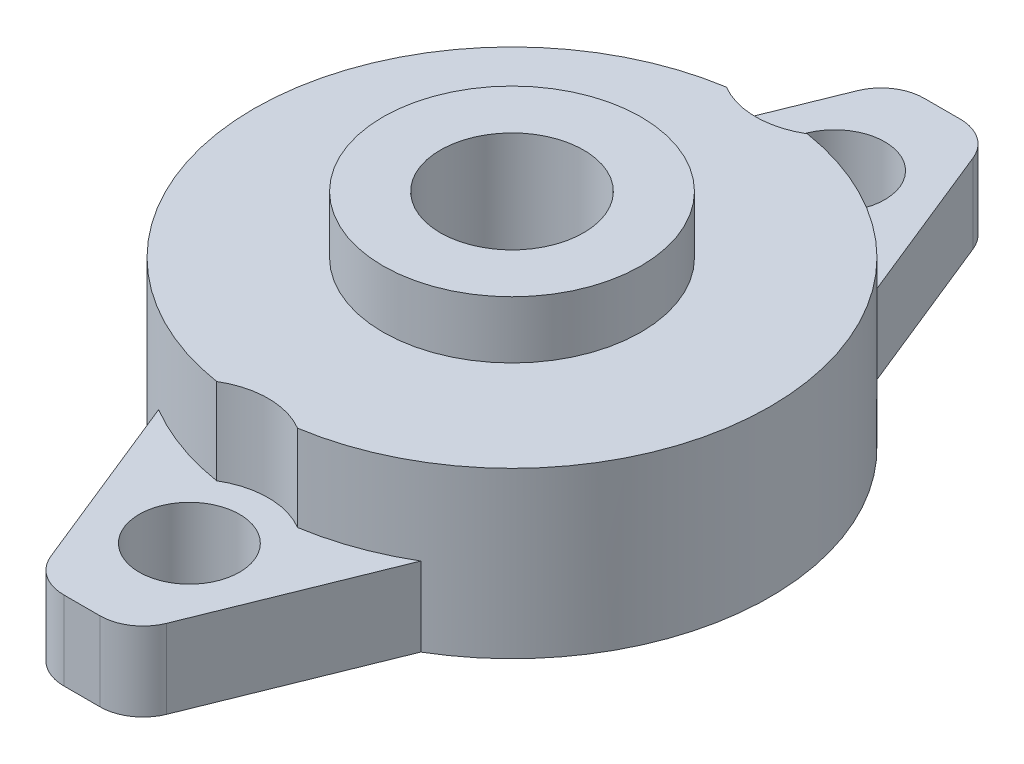
ISO-10303-21;
HEADER;
FILE_DESCRIPTION(('STEP AP214'),'2;1');
FILE_NAME('part.step','',(''),(''),'','','');
FILE_SCHEMA(('AUTOMOTIVE_DESIGN { 1 0 10303 214 1 1 1 1 }'));
ENDSEC;
DATA;
#1=APPLICATION_CONTEXT('core data for automotive mechanical design processes');
#2=APPLICATION_PROTOCOL_DEFINITION('international standard','automotive_design',2000,#1);
#3=PRODUCT_CONTEXT('',#1,'mechanical');
#4=PRODUCT('Part','Part','',(#3));
#5=PRODUCT_RELATED_PRODUCT_CATEGORY('part','',(#4));
#6=PRODUCT_DEFINITION_FORMATION('','',#4);
#7=PRODUCT_DEFINITION_CONTEXT('part definition',#1,'design');
#8=PRODUCT_DEFINITION('design','',#6,#7);
#9=PRODUCT_DEFINITION_SHAPE('','',#8);
#10=(LENGTH_UNIT() NAMED_UNIT(*) SI_UNIT(.MILLI.,.METRE.));
#11=(NAMED_UNIT(*) PLANE_ANGLE_UNIT() SI_UNIT($,.RADIAN.));
#12=(NAMED_UNIT(*) SI_UNIT($,.STERADIAN.) SOLID_ANGLE_UNIT());
#13=UNCERTAINTY_MEASURE_WITH_UNIT(LENGTH_MEASURE(1.E-05),#10,'distance_accuracy_value','');
#14=(GEOMETRIC_REPRESENTATION_CONTEXT(3) GLOBAL_UNCERTAINTY_ASSIGNED_CONTEXT((#13)) GLOBAL_UNIT_ASSIGNED_CONTEXT((#10,
#11,#12)) REPRESENTATION_CONTEXT('',''));
#15=CARTESIAN_POINT('',(0.,0.,0.));
#16=DIRECTION('',(0.,0.,1.));
#17=DIRECTION('',(1.,0.,0.));
#18=AXIS2_PLACEMENT_3D('',#15,#16,#17);
#19=CARTESIAN_POINT('',(0.,-4.5,0.));
#20=DIRECTION('',(0.,1.,0.));
#21=DIRECTION('',(0.,0.,1.));
#22=AXIS2_PLACEMENT_3D('',#19,#20,#21);
#23=CYLINDRICAL_SURFACE('',#22,5.);
#24=CARTESIAN_POINT('',(0.,15.5,0.));
#25=DIRECTION('',(0.,1.,0.));
#26=DIRECTION('',(0.,0.,1.));
#27=AXIS2_PLACEMENT_3D('',#24,#25,#26);
#28=CIRCLE('',#27,5.);
#29=CARTESIAN_POINT('',(0.,15.5,5.));
#30=VERTEX_POINT('',#29);
#31=EDGE_CURVE('E278',#30,#30,#28,.T.);
#32=ORIENTED_EDGE('',*,*,#31,.T.);
#33=EDGE_LOOP('',(#32));
#34=FACE_BOUND('',#33,.T.);
#35=CARTESIAN_POINT('',(0.,1.5,0.));
#36=DIRECTION('',(0.,-1.,0.));
#37=DIRECTION('',(0.,0.,-1.));
#38=AXIS2_PLACEMENT_3D('',#35,#36,#37);
#39=CIRCLE('',#38,5.);
#40=CARTESIAN_POINT('',(0.,1.5,-5.));
#41=VERTEX_POINT('',#40);
#42=EDGE_CURVE('E39',#41,#41,#39,.F.);
#43=ORIENTED_EDGE('',*,*,#42,.F.);
#44=EDGE_LOOP('',(#43));
#45=FACE_BOUND('',#44,.T.);
#46=ADVANCED_FACE('F35',(#34,#45),#23,.F.);
#47=CARTESIAN_POINT('',(0.,5.5,0.));
#48=DIRECTION('',(0.,1.,0.));
#49=DIRECTION('',(0.,0.,1.));
#50=AXIS2_PLACEMENT_3D('',#47,#48,#49);
#51=PLANE('',#50);
#52=CARTESIAN_POINT('',(0.,5.5,-22.5));
#53=DIRECTION('',(0.,1.,0.));
#54=DIRECTION('',(0.,0.,1.));
#55=AXIS2_PLACEMENT_3D('',#52,#53,#54);
#56=CIRCLE('',#55,3.5);
#57=CARTESIAN_POINT('',(0.,5.5,-19.));
#58=VERTEX_POINT('',#57);
#59=EDGE_CURVE('E185',#58,#58,#56,.T.);
#60=ORIENTED_EDGE('',*,*,#59,.F.);
#61=EDGE_LOOP('',(#60));
#62=FACE_BOUND('',#61,.T.);
#63=CARTESIAN_POINT('',(0.,5.5,0.));
#64=DIRECTION('',(0.,1.,0.));
#65=DIRECTION('',(0.,0.,1.));
#66=AXIS2_PLACEMENT_3D('',#63,#64,#65);
#67=CIRCLE('',#66,18.);
#68=CARTESIAN_POINT('',(-2.81968389787767,5.5,-17.7777777777778));
#69=VERTEX_POINT('',#68);
#70=CARTESIAN_POINT('',(-9.14202519140061,5.5,-15.5055917461991));
#71=VERTEX_POINT('',#70);
#72=EDGE_CURVE('E52',#69,#71,#67,.T.);
#73=ORIENTED_EDGE('',*,*,#72,.F.);
#74=CARTESIAN_POINT('',(0.,5.5,-22.5));
#75=DIRECTION('',(0.,-1.,0.));
#76=DIRECTION('',(0.,0.,1.));
#77=AXIS2_PLACEMENT_3D('',#74,#75,#76);
#78=CIRCLE('',#77,5.49999999999999);
#79=CARTESIAN_POINT('',(2.81968389787766,5.5,-17.7777777777778));
#80=VERTEX_POINT('',#79);
#81=EDGE_CURVE('E56',#80,#69,#78,.T.);
#82=ORIENTED_EDGE('',*,*,#81,.F.);
#83=CARTESIAN_POINT('',(0.,5.5,0.));
#84=DIRECTION('',(0.,1.,0.));
#85=DIRECTION('',(0.,0.,1.));
#86=AXIS2_PLACEMENT_3D('',#83,#84,#85);
#87=CIRCLE('',#86,18.);
#88=CARTESIAN_POINT('',(9.14202519140061,5.5,-15.5055917461991));
#89=VERTEX_POINT('',#88);
#90=EDGE_CURVE('E44',#89,#80,#87,.T.);
#91=ORIENTED_EDGE('',*,*,#90,.F.);
#92=DIRECTION('',(-0.374603074429063,0.,-0.927185276321995));
#93=VECTOR('',#92,1.);
#94=CARTESIAN_POINT('',(4.04399011530196,5.5,-28.1238092232872));
#95=LINE('',#94,#93);
#96=CARTESIAN_POINT('',(4.04399011530196,5.5,-28.1238092232872));
#97=VERTEX_POINT('',#96);
#98=EDGE_CURVE('E202',#89,#97,#95,.T.);
#99=ORIENTED_EDGE('',*,*,#98,.T.);
#100=CARTESIAN_POINT('',(1.26243428633598,5.5,-27.));
#101=DIRECTION('',(0.,1.,0.));
#102=DIRECTION('',(0.,0.,-1.));
#103=AXIS2_PLACEMENT_3D('',#100,#101,#102);
#104=CIRCLE('',#103,3.);
#105=CARTESIAN_POINT('',(1.26243428633598,5.5,-30.));
#106=VERTEX_POINT('',#105);
#107=EDGE_CURVE('E204',#97,#106,#104,.T.);
#108=ORIENTED_EDGE('',*,*,#107,.T.);
#109=DIRECTION('',(-1.,0.,0.));
#110=VECTOR('',#109,1.);
#111=CARTESIAN_POINT('',(-1.26243428633598,5.5,-30.));
#112=LINE('',#111,#110);
#113=CARTESIAN_POINT('',(-1.26243428633598,5.5,-30.));
#114=VERTEX_POINT('',#113);
#115=EDGE_CURVE('E206',#106,#114,#112,.T.);
#116=ORIENTED_EDGE('',*,*,#115,.T.);
#117=CARTESIAN_POINT('',(-1.26243428633598,5.5,-27.0000000000001));
#118=DIRECTION('',(0.,1.,0.));
#119=DIRECTION('',(0.,0.,-1.));
#120=AXIS2_PLACEMENT_3D('',#117,#118,#119);
#121=CIRCLE('',#120,2.99999999999993);
#122=CARTESIAN_POINT('',(-4.0439901153019,5.5,-28.1238092232872));
#123=VERTEX_POINT('',#122);
#124=EDGE_CURVE('E208',#114,#123,#121,.T.);
#125=ORIENTED_EDGE('',*,*,#124,.T.);
#126=DIRECTION('',(-0.374603074429066,0.,0.927185276321994));
#127=VECTOR('',#126,1.);
#128=CARTESIAN_POINT('',(-9.14202519140061,5.5,-15.5055917461991));
#129=LINE('',#128,#127);
#130=EDGE_CURVE('E210',#123,#71,#129,.T.);
#131=ORIENTED_EDGE('',*,*,#130,.T.);
#132=EDGE_LOOP('',(#73,#82,#91,#99,#108,#116,#125,#131));
#133=FACE_BOUND('',#132,.T.);
#134=ADVANCED_FACE('F317',(#62,#133),#51,.T.);
#135=CARTESIAN_POINT('',(0.,5.5,22.5));
#136=DIRECTION('',(0.,1.,0.));
#137=DIRECTION('',(0.,0.,1.));
#138=AXIS2_PLACEMENT_3D('',#135,#136,#137);
#139=CIRCLE('',#138,3.5);
#140=CARTESIAN_POINT('',(0.,5.5,26.));
#141=VERTEX_POINT('',#140);
#142=EDGE_CURVE('E176',#141,#141,#139,.T.);
#143=ORIENTED_EDGE('',*,*,#142,.F.);
#144=EDGE_LOOP('',(#143));
#145=FACE_BOUND('',#144,.T.);
#146=CARTESIAN_POINT('',(-9.14202519140061,5.5,15.5055917461991));
#147=VERTEX_POINT('',#146);
#148=CARTESIAN_POINT('',(-2.81968389787766,5.5,17.7777777777778));
#149=VERTEX_POINT('',#148);
#150=EDGE_CURVE('E172',#147,#149,#67,.T.);
#151=ORIENTED_EDGE('',*,*,#150,.F.);
#152=DIRECTION('',(0.374603074429063,0.,0.927185276321995));
#153=VECTOR('',#152,1.);
#154=CARTESIAN_POINT('',(-9.14202519140061,5.5,15.5055917461991));
#155=LINE('',#154,#153);
#156=CARTESIAN_POINT('',(-4.04399011530194,5.5,28.1238092232872));
#157=VERTEX_POINT('',#156);
#158=EDGE_CURVE('E191',#147,#157,#155,.T.);
#159=ORIENTED_EDGE('',*,*,#158,.T.);
#160=CARTESIAN_POINT('',(-1.26243428633598,5.5,27.0000000000001));
#161=DIRECTION('',(0.,1.,0.));
#162=DIRECTION('',(0.,0.,1.));
#163=AXIS2_PLACEMENT_3D('',#160,#161,#162);
#164=CIRCLE('',#163,2.99999999999995);
#165=CARTESIAN_POINT('',(-1.26243428633598,5.5,30.));
#166=VERTEX_POINT('',#165);
#167=EDGE_CURVE('E193',#157,#166,#164,.T.);
#168=ORIENTED_EDGE('',*,*,#167,.T.);
#169=DIRECTION('',(1.,0.,0.));
#170=VECTOR('',#169,1.);
#171=CARTESIAN_POINT('',(-1.26243428633598,5.5,30.));
#172=LINE('',#171,#170);
#173=CARTESIAN_POINT('',(1.26243428633598,5.5,30.));
#174=VERTEX_POINT('',#173);
#175=EDGE_CURVE('E196',#166,#174,#172,.T.);
#176=ORIENTED_EDGE('',*,*,#175,.T.);
#177=CARTESIAN_POINT('',(1.26243428633598,5.5,27.));
#178=DIRECTION('',(0.,1.,0.));
#179=DIRECTION('',(0.,0.,-1.));
#180=AXIS2_PLACEMENT_3D('',#177,#178,#179);
#181=CIRCLE('',#180,3.);
#182=CARTESIAN_POINT('',(4.04399011530196,5.5,28.1238092232872));
#183=VERTEX_POINT('',#182);
#184=EDGE_CURVE('E198',#174,#183,#181,.T.);
#185=ORIENTED_EDGE('',*,*,#184,.T.);
#186=DIRECTION('',(0.374603074429063,0.,-0.927185276321995));
#187=VECTOR('',#186,1.);
#188=CARTESIAN_POINT('',(4.04399011530196,5.5,28.1238092232872));
#189=LINE('',#188,#187);
#190=CARTESIAN_POINT('',(9.14202519140061,5.5,15.5055917461991));
#191=VERTEX_POINT('',#190);
#192=EDGE_CURVE('E200',#183,#191,#189,.T.);
#193=ORIENTED_EDGE('',*,*,#192,.T.);
#194=CARTESIAN_POINT('',(2.81968389787767,5.5,17.7777777777778));
#195=VERTEX_POINT('',#194);
#196=EDGE_CURVE('E272',#195,#191,#87,.T.);
#197=ORIENTED_EDGE('',*,*,#196,.F.);
#198=CARTESIAN_POINT('',(0.,5.5,22.5));
#199=DIRECTION('',(0.,-1.,0.));
#200=DIRECTION('',(0.,0.,1.));
#201=AXIS2_PLACEMENT_3D('',#198,#199,#200);
#202=CIRCLE('',#201,5.49999999999999);
#203=EDGE_CURVE('E275',#149,#195,#202,.T.);
#204=ORIENTED_EDGE('',*,*,#203,.F.);
#205=EDGE_LOOP('',(#151,#159,#168,#176,#185,#193,#197,#204));
#206=FACE_BOUND('',#205,.T.);
#207=ADVANCED_FACE('F296',(#145,#206),#51,.T.);
#208=CARTESIAN_POINT('',(0.,0.,0.));
#209=DIRECTION('',(0.,1.,0.));
#210=DIRECTION('',(0.,0.,1.));
#211=AXIS2_PLACEMENT_3D('',#208,#209,#210);
#212=PLANE('',#211);
#213=CARTESIAN_POINT('',(0.,0.,0.));
#214=DIRECTION('',(0.,-1.,0.));
#215=DIRECTION('',(0.,0.,-1.));
#216=AXIS2_PLACEMENT_3D('',#213,#214,#215);
#217=CIRCLE('',#216,14.);
#218=CARTESIAN_POINT('',(0.,0.,-14.));
#219=VERTEX_POINT('',#218);
#220=EDGE_CURVE('E552',#219,#219,#217,.T.);
#221=ORIENTED_EDGE('',*,*,#220,.F.);
#222=EDGE_LOOP('',(#221));
#223=FACE_BOUND('',#222,.T.);
#224=CARTESIAN_POINT('',(0.,0.,0.));
#225=DIRECTION('',(0.,1.,0.));
#226=DIRECTION('',(0.,0.,1.));
#227=AXIS2_PLACEMENT_3D('',#224,#225,#226);
#228=CIRCLE('',#227,18.);
#229=CARTESIAN_POINT('',(-9.14202519140061,0.,-15.5055917461991));
#230=VERTEX_POINT('',#229);
#231=CARTESIAN_POINT('',(-9.14202519140061,0.,15.5055917461991));
#232=VERTEX_POINT('',#231);
#233=EDGE_CURVE('E188',#230,#232,#228,.T.);
#234=ORIENTED_EDGE('',*,*,#233,.F.);
#235=DIRECTION('',(-0.374603074429066,0.,0.927185276321994));
#236=VECTOR('',#235,1.);
#237=CARTESIAN_POINT('',(-9.14202519140061,0.,-15.5055917461991));
#238=LINE('',#237,#236);
#239=CARTESIAN_POINT('',(-4.0439901153019,0.,-28.1238092232872));
#240=VERTEX_POINT('',#239);
#241=EDGE_CURVE('E194',#240,#230,#238,.T.);
#242=ORIENTED_EDGE('',*,*,#241,.F.);
#243=CARTESIAN_POINT('',(-1.26243428633598,0.,-27.0000000000001));
#244=DIRECTION('',(0.,1.,0.));
#245=DIRECTION('',(0.,0.,-1.));
#246=AXIS2_PLACEMENT_3D('',#243,#244,#245);
#247=CIRCLE('',#246,2.99999999999993);
#248=CARTESIAN_POINT('',(-1.26243428633598,0.,-30.));
#249=VERTEX_POINT('',#248);
#250=EDGE_CURVE('E232',#249,#240,#247,.T.);
#251=ORIENTED_EDGE('',*,*,#250,.F.);
#252=DIRECTION('',(-1.,0.,0.));
#253=VECTOR('',#252,1.);
#254=CARTESIAN_POINT('',(-1.26243428633598,0.,-30.));
#255=LINE('',#254,#253);
#256=CARTESIAN_POINT('',(1.26243428633598,0.,-30.));
#257=VERTEX_POINT('',#256);
#258=EDGE_CURVE('E230',#257,#249,#255,.T.);
#259=ORIENTED_EDGE('',*,*,#258,.F.);
#260=CARTESIAN_POINT('',(1.26243428633598,0.,-27.));
#261=DIRECTION('',(0.,1.,0.));
#262=DIRECTION('',(0.,0.,-1.));
#263=AXIS2_PLACEMENT_3D('',#260,#261,#262);
#264=CIRCLE('',#263,3.);
#265=CARTESIAN_POINT('',(4.04399011530196,0.,-28.1238092232872));
#266=VERTEX_POINT('',#265);
#267=EDGE_CURVE('E228',#266,#257,#264,.T.);
#268=ORIENTED_EDGE('',*,*,#267,.F.);
#269=DIRECTION('',(-0.374603074429063,0.,-0.927185276321995));
#270=VECTOR('',#269,1.);
#271=CARTESIAN_POINT('',(4.04399011530196,0.,-28.1238092232872));
#272=LINE('',#271,#270);
#273=CARTESIAN_POINT('',(9.14202519140061,0.,-15.5055917461991));
#274=VERTEX_POINT('',#273);
#275=EDGE_CURVE('E226',#274,#266,#272,.T.);
#276=ORIENTED_EDGE('',*,*,#275,.F.);
#277=CARTESIAN_POINT('',(0.,0.,0.));
#278=DIRECTION('',(0.,1.,0.));
#279=DIRECTION('',(0.,0.,1.));
#280=AXIS2_PLACEMENT_3D('',#277,#278,#279);
#281=CIRCLE('',#280,18.);
#282=CARTESIAN_POINT('',(9.14202519140061,0.,15.5055917461991));
#283=VERTEX_POINT('',#282);
#284=EDGE_CURVE('E224',#283,#274,#281,.T.);
#285=ORIENTED_EDGE('',*,*,#284,.F.);
#286=DIRECTION('',(0.374603074429063,0.,-0.927185276321995));
#287=VECTOR('',#286,1.);
#288=CARTESIAN_POINT('',(4.04399011530196,0.,28.1238092232872));
#289=LINE('',#288,#287);
#290=CARTESIAN_POINT('',(4.04399011530196,0.,28.1238092232872));
#291=VERTEX_POINT('',#290);
#292=EDGE_CURVE('E222',#291,#283,#289,.T.);
#293=ORIENTED_EDGE('',*,*,#292,.F.);
#294=CARTESIAN_POINT('',(1.26243428633598,0.,27.));
#295=DIRECTION('',(0.,1.,0.));
#296=DIRECTION('',(0.,0.,-1.));
#297=AXIS2_PLACEMENT_3D('',#294,#295,#296);
#298=CIRCLE('',#297,3.);
#299=CARTESIAN_POINT('',(1.26243428633598,0.,30.));
#300=VERTEX_POINT('',#299);
#301=EDGE_CURVE('E220',#300,#291,#298,.T.);
#302=ORIENTED_EDGE('',*,*,#301,.F.);
#303=DIRECTION('',(1.,0.,0.));
#304=VECTOR('',#303,1.);
#305=CARTESIAN_POINT('',(-1.26243428633598,0.,30.));
#306=LINE('',#305,#304);
#307=CARTESIAN_POINT('',(-1.26243428633598,0.,30.));
#308=VERTEX_POINT('',#307);
#309=EDGE_CURVE('E218',#308,#300,#306,.T.);
#310=ORIENTED_EDGE('',*,*,#309,.F.);
#311=CARTESIAN_POINT('',(-1.26243428633598,0.,27.0000000000001));
#312=DIRECTION('',(0.,1.,0.));
#313=DIRECTION('',(0.,0.,1.));
#314=AXIS2_PLACEMENT_3D('',#311,#312,#313);
#315=CIRCLE('',#314,2.99999999999995);
#316=CARTESIAN_POINT('',(-4.04399011530194,0.,28.1238092232872));
#317=VERTEX_POINT('',#316);
#318=EDGE_CURVE('E216',#317,#308,#315,.T.);
#319=ORIENTED_EDGE('',*,*,#318,.F.);
#320=DIRECTION('',(0.374603074429063,0.,0.927185276321995));
#321=VECTOR('',#320,1.);
#322=CARTESIAN_POINT('',(-9.14202519140061,0.,15.5055917461991));
#323=LINE('',#322,#321);
#324=EDGE_CURVE('E214',#232,#317,#323,.T.);
#325=ORIENTED_EDGE('',*,*,#324,.F.);
#326=EDGE_LOOP('',(#234,#242,#251,#259,#268,#276,#285,#293,#302,#310,#319,#325));
#327=FACE_BOUND('',#326,.T.);
#328=CARTESIAN_POINT('',(0.,0.,-22.5));
#329=DIRECTION('',(0.,1.,0.));
#330=DIRECTION('',(0.,0.,1.));
#331=AXIS2_PLACEMENT_3D('',#328,#329,#330);
#332=CIRCLE('',#331,3.5);
#333=CARTESIAN_POINT('',(0.,0.,-19.));
#334=VERTEX_POINT('',#333);
#335=EDGE_CURVE('E183',#334,#334,#332,.T.);
#336=ORIENTED_EDGE('',*,*,#335,.T.);
#337=EDGE_LOOP('',(#336));
#338=FACE_BOUND('',#337,.T.);
#339=CARTESIAN_POINT('',(0.,0.,22.5));
#340=DIRECTION('',(0.,1.,0.));
#341=DIRECTION('',(0.,0.,1.));
#342=AXIS2_PLACEMENT_3D('',#339,#340,#341);
#343=CIRCLE('',#342,3.5);
#344=CARTESIAN_POINT('',(0.,0.,26.));
#345=VERTEX_POINT('',#344);
#346=EDGE_CURVE('E173',#345,#345,#343,.T.);
#347=ORIENTED_EDGE('',*,*,#346,.T.);
#348=EDGE_LOOP('',(#347));
#349=FACE_BOUND('',#348,.T.);
#350=ADVANCED_FACE('F306',(#223,#327,#338,#349),#212,.F.);
#351=CARTESIAN_POINT('',(0.,5.5,0.));
#352=DIRECTION('',(0.,-1.,0.));
#353=DIRECTION('',(0.,0.,-1.));
#354=AXIS2_PLACEMENT_3D('',#351,#352,#353);
#355=CYLINDRICAL_SURFACE('',#354,18.);
#356=ORIENTED_EDGE('',*,*,#233,.T.);
#357=DIRECTION('',(0.,-1.,0.));
#358=VECTOR('',#357,1.);
#359=CARTESIAN_POINT('',(-9.14202519140061,5.5,15.5055917461991));
#360=LINE('',#359,#358);
#361=EDGE_CURVE('E266',#147,#232,#360,.T.);
#362=ORIENTED_EDGE('',*,*,#361,.F.);
#363=ORIENTED_EDGE('',*,*,#150,.T.);
#364=DIRECTION('',(0.,-1.,0.));
#365=VECTOR('',#364,1.);
#366=CARTESIAN_POINT('',(-2.81968389787766,11.5,17.7777777777778));
#367=LINE('',#366,#365);
#368=CARTESIAN_POINT('',(-2.81968389787766,11.5,17.7777777777778));
#369=VERTEX_POINT('',#368);
#370=EDGE_CURVE('E153',#369,#149,#367,.T.);
#371=ORIENTED_EDGE('',*,*,#370,.F.);
#372=CARTESIAN_POINT('',(0.,11.5,0.));
#373=DIRECTION('',(0.,1.,0.));
#374=DIRECTION('',(0.,0.,1.));
#375=AXIS2_PLACEMENT_3D('',#372,#373,#374);
#376=CIRCLE('',#375,18.);
#377=CARTESIAN_POINT('',(-2.81968389787767,11.5,-17.7777777777778));
#378=VERTEX_POINT('',#377);
#379=EDGE_CURVE('E159',#378,#369,#376,.T.);
#380=ORIENTED_EDGE('',*,*,#379,.F.);
#381=DIRECTION('',(0.,-1.,0.));
#382=VECTOR('',#381,1.);
#383=CARTESIAN_POINT('',(-2.81968389787767,11.5,-17.7777777777778));
#384=LINE('',#383,#382);
#385=EDGE_CURVE('E286',#378,#69,#384,.T.);
#386=ORIENTED_EDGE('',*,*,#385,.T.);
#387=ORIENTED_EDGE('',*,*,#72,.T.);
#388=DIRECTION('',(0.,-1.,0.));
#389=VECTOR('',#388,1.);
#390=CARTESIAN_POINT('',(-9.14202519140061,5.5,-15.5055917461991));
#391=LINE('',#390,#389);
#392=EDGE_CURVE('E212',#71,#230,#391,.T.);
#393=ORIENTED_EDGE('',*,*,#392,.T.);
#394=EDGE_LOOP('',(#356,#362,#363,#371,#380,#386,#387,#393));
#395=FACE_BOUND('',#394,.T.);
#396=ADVANCED_FACE('F37',(#395),#355,.T.);
#397=CARTESIAN_POINT('',(-9.14202519140061,5.5,15.5055917461991));
#398=DIRECTION('',(0.927185276321995,0.,-0.374603074429063));
#399=DIRECTION('',(-0.374603074429063,0.,-0.927185276321995));
#400=AXIS2_PLACEMENT_3D('',#397,#398,#399);
#401=PLANE('',#400);
#402=ORIENTED_EDGE('',*,*,#324,.T.);
#403=DIRECTION('',(0.,-1.,0.));
#404=VECTOR('',#403,1.);
#405=CARTESIAN_POINT('',(-4.04399011530194,5.5,28.1238092232872));
#406=LINE('',#405,#404);
#407=EDGE_CURVE('E264',#157,#317,#406,.T.);
#408=ORIENTED_EDGE('',*,*,#407,.F.);
#409=ORIENTED_EDGE('',*,*,#158,.F.);
#410=ORIENTED_EDGE('',*,*,#361,.T.);
#411=EDGE_LOOP('',(#402,#408,#409,#410));
#412=FACE_BOUND('',#411,.T.);
#413=ADVANCED_FACE('F425',(#412),#401,.F.);
#414=CARTESIAN_POINT('',(-1.26243428633598,5.5,27.0000000000001));
#415=DIRECTION('',(0.,-1.,0.));
#416=DIRECTION('',(0.,0.,-1.));
#417=AXIS2_PLACEMENT_3D('',#414,#415,#416);
#418=CYLINDRICAL_SURFACE('',#417,2.99999999999995);
#419=ORIENTED_EDGE('',*,*,#318,.T.);
#420=DIRECTION('',(0.,-1.,0.));
#421=VECTOR('',#420,1.);
#422=CARTESIAN_POINT('',(-1.26243428633598,5.5,30.));
#423=LINE('',#422,#421);
#424=EDGE_CURVE('E261',#166,#308,#423,.T.);
#425=ORIENTED_EDGE('',*,*,#424,.F.);
#426=ORIENTED_EDGE('',*,*,#167,.F.);
#427=ORIENTED_EDGE('',*,*,#407,.T.);
#428=EDGE_LOOP('',(#419,#425,#426,#427));
#429=FACE_BOUND('',#428,.T.);
#430=ADVANCED_FACE('F526',(#429),#418,.T.);
#431=CARTESIAN_POINT('',(-1.26243428633598,5.5,30.));
#432=DIRECTION('',(0.,0.,-1.));
#433=DIRECTION('',(-1.,0.,0.));
#434=AXIS2_PLACEMENT_3D('',#431,#432,#433);
#435=PLANE('',#434);
#436=ORIENTED_EDGE('',*,*,#309,.T.);
#437=DIRECTION('',(0.,-1.,0.));
#438=VECTOR('',#437,1.);
#439=CARTESIAN_POINT('',(1.26243428633598,5.5,30.));
#440=LINE('',#439,#438);
#441=EDGE_CURVE('E258',#174,#300,#440,.T.);
#442=ORIENTED_EDGE('',*,*,#441,.F.);
#443=ORIENTED_EDGE('',*,*,#175,.F.);
#444=ORIENTED_EDGE('',*,*,#424,.T.);
#445=EDGE_LOOP('',(#436,#442,#443,#444));
#446=FACE_BOUND('',#445,.T.);
#447=ADVANCED_FACE('F518',(#446),#435,.F.);
#448=CARTESIAN_POINT('',(1.26243428633598,5.5,27.));
#449=DIRECTION('',(0.,-1.,0.));
#450=DIRECTION('',(0.,0.,-1.));
#451=AXIS2_PLACEMENT_3D('',#448,#449,#450);
#452=CYLINDRICAL_SURFACE('',#451,3.);
#453=ORIENTED_EDGE('',*,*,#301,.T.);
#454=DIRECTION('',(0.,-1.,0.));
#455=VECTOR('',#454,1.);
#456=CARTESIAN_POINT('',(4.04399011530196,5.5,28.1238092232872));
#457=LINE('',#456,#455);
#458=EDGE_CURVE('E255',#183,#291,#457,.T.);
#459=ORIENTED_EDGE('',*,*,#458,.F.);
#460=ORIENTED_EDGE('',*,*,#184,.F.);
#461=ORIENTED_EDGE('',*,*,#441,.T.);
#462=EDGE_LOOP('',(#453,#459,#460,#461));
#463=FACE_BOUND('',#462,.T.);
#464=ADVANCED_FACE('F513',(#463),#452,.T.);
#465=CARTESIAN_POINT('',(4.04399011530196,5.5,28.1238092232872));
#466=DIRECTION('',(-0.927185276321995,0.,-0.374603074429063));
#467=DIRECTION('',(-0.374603074429063,0.,0.927185276321995));
#468=AXIS2_PLACEMENT_3D('',#465,#466,#467);
#469=PLANE('',#468);
#470=ORIENTED_EDGE('',*,*,#292,.T.);
#471=DIRECTION('',(0.,-1.,0.));
#472=VECTOR('',#471,1.);
#473=CARTESIAN_POINT('',(9.14202519140061,5.5,15.5055917461991));
#474=LINE('',#473,#472);
#475=EDGE_CURVE('E252',#191,#283,#474,.T.);
#476=ORIENTED_EDGE('',*,*,#475,.F.);
#477=ORIENTED_EDGE('',*,*,#192,.F.);
#478=ORIENTED_EDGE('',*,*,#458,.T.);
#479=EDGE_LOOP('',(#470,#476,#477,#478));
#480=FACE_BOUND('',#479,.T.);
#481=ADVANCED_FACE('F301',(#480),#469,.F.);
#482=CARTESIAN_POINT('',(0.,5.5,0.));
#483=DIRECTION('',(0.,-1.,0.));
#484=DIRECTION('',(0.,0.,-1.));
#485=AXIS2_PLACEMENT_3D('',#482,#483,#484);
#486=CYLINDRICAL_SURFACE('',#485,18.);
#487=ORIENTED_EDGE('',*,*,#284,.T.);
#488=DIRECTION('',(0.,-1.,0.));
#489=VECTOR('',#488,1.);
#490=CARTESIAN_POINT('',(9.14202519140061,5.5,-15.5055917461991));
#491=LINE('',#490,#489);
#492=EDGE_CURVE('E249',#89,#274,#491,.T.);
#493=ORIENTED_EDGE('',*,*,#492,.F.);
#494=ORIENTED_EDGE('',*,*,#90,.T.);
#495=DIRECTION('',(0.,-1.,0.));
#496=VECTOR('',#495,1.);
#497=CARTESIAN_POINT('',(2.81968389787766,11.5,-17.7777777777778));
#498=LINE('',#497,#496);
#499=CARTESIAN_POINT('',(2.81968389787766,11.5,-17.7777777777778));
#500=VERTEX_POINT('',#499);
#501=EDGE_CURVE('E178',#500,#80,#498,.T.);
#502=ORIENTED_EDGE('',*,*,#501,.F.);
#503=CARTESIAN_POINT('',(0.,11.5,0.));
#504=DIRECTION('',(0.,1.,0.));
#505=DIRECTION('',(0.,0.,1.));
#506=AXIS2_PLACEMENT_3D('',#503,#504,#505);
#507=CIRCLE('',#506,18.);
#508=CARTESIAN_POINT('',(2.81968389787767,11.5,17.7777777777778));
#509=VERTEX_POINT('',#508);
#510=EDGE_CURVE('E158',#509,#500,#507,.T.);
#511=ORIENTED_EDGE('',*,*,#510,.F.);
#512=DIRECTION('',(0.,-1.,0.));
#513=VECTOR('',#512,1.);
#514=CARTESIAN_POINT('',(2.81968389787767,11.5,17.7777777777778));
#515=LINE('',#514,#513);
#516=EDGE_CURVE('E155',#509,#195,#515,.T.);
#517=ORIENTED_EDGE('',*,*,#516,.T.);
#518=ORIENTED_EDGE('',*,*,#196,.T.);
#519=ORIENTED_EDGE('',*,*,#475,.T.);
#520=EDGE_LOOP('',(#487,#493,#494,#502,#511,#517,#518,#519));
#521=FACE_BOUND('',#520,.T.);
#522=ADVANCED_FACE('F292',(#521),#486,.T.);
#523=CARTESIAN_POINT('',(4.04399011530196,5.5,-28.1238092232872));
#524=DIRECTION('',(-0.927185276321995,0.,0.374603074429063));
#525=DIRECTION('',(0.374603074429063,0.,0.927185276321995));
#526=AXIS2_PLACEMENT_3D('',#523,#524,#525);
#527=PLANE('',#526);
#528=ORIENTED_EDGE('',*,*,#275,.T.);
#529=DIRECTION('',(0.,-1.,0.));
#530=VECTOR('',#529,1.);
#531=CARTESIAN_POINT('',(4.04399011530196,5.5,-28.1238092232872));
#532=LINE('',#531,#530);
#533=EDGE_CURVE('E246',#97,#266,#532,.T.);
#534=ORIENTED_EDGE('',*,*,#533,.F.);
#535=ORIENTED_EDGE('',*,*,#98,.F.);
#536=ORIENTED_EDGE('',*,*,#492,.T.);
#537=EDGE_LOOP('',(#528,#534,#535,#536));
#538=FACE_BOUND('',#537,.T.);
#539=ADVANCED_FACE('F314',(#538),#527,.F.);
#540=CARTESIAN_POINT('',(1.26243428633598,5.5,-27.));
#541=DIRECTION('',(0.,-1.,0.));
#542=DIRECTION('',(0.,0.,-1.));
#543=AXIS2_PLACEMENT_3D('',#540,#541,#542);
#544=CYLINDRICAL_SURFACE('',#543,3.);
#545=ORIENTED_EDGE('',*,*,#267,.T.);
#546=DIRECTION('',(0.,-1.,0.));
#547=VECTOR('',#546,1.);
#548=CARTESIAN_POINT('',(1.26243428633598,5.5,-30.));
#549=LINE('',#548,#547);
#550=EDGE_CURVE('E243',#106,#257,#549,.T.);
#551=ORIENTED_EDGE('',*,*,#550,.F.);
#552=ORIENTED_EDGE('',*,*,#107,.F.);
#553=ORIENTED_EDGE('',*,*,#533,.T.);
#554=EDGE_LOOP('',(#545,#551,#552,#553));
#555=FACE_BOUND('',#554,.T.);
#556=ADVANCED_FACE('F484',(#555),#544,.T.);
#557=CARTESIAN_POINT('',(-1.26243428633598,5.5,-30.));
#558=DIRECTION('',(0.,0.,1.));
#559=DIRECTION('',(1.,0.,0.));
#560=AXIS2_PLACEMENT_3D('',#557,#558,#559);
#561=PLANE('',#560);
#562=ORIENTED_EDGE('',*,*,#258,.T.);
#563=DIRECTION('',(0.,-1.,0.));
#564=VECTOR('',#563,1.);
#565=CARTESIAN_POINT('',(-1.26243428633598,5.5,-30.));
#566=LINE('',#565,#564);
#567=EDGE_CURVE('E240',#114,#249,#566,.T.);
#568=ORIENTED_EDGE('',*,*,#567,.F.);
#569=ORIENTED_EDGE('',*,*,#115,.F.);
#570=ORIENTED_EDGE('',*,*,#550,.T.);
#571=EDGE_LOOP('',(#562,#568,#569,#570));
#572=FACE_BOUND('',#571,.T.);
#573=ADVANCED_FACE('F475',(#572),#561,.F.);
#574=CARTESIAN_POINT('',(-1.26243428633598,5.5,-27.0000000000001));
#575=DIRECTION('',(0.,-1.,0.));
#576=DIRECTION('',(0.,0.,-1.));
#577=AXIS2_PLACEMENT_3D('',#574,#575,#576);
#578=CYLINDRICAL_SURFACE('',#577,2.99999999999993);
#579=ORIENTED_EDGE('',*,*,#250,.T.);
#580=DIRECTION('',(0.,-1.,0.));
#581=VECTOR('',#580,1.);
#582=CARTESIAN_POINT('',(-4.0439901153019,5.5,-28.1238092232872));
#583=LINE('',#582,#581);
#584=EDGE_CURVE('E237',#123,#240,#583,.T.);
#585=ORIENTED_EDGE('',*,*,#584,.F.);
#586=ORIENTED_EDGE('',*,*,#124,.F.);
#587=ORIENTED_EDGE('',*,*,#567,.T.);
#588=EDGE_LOOP('',(#579,#585,#586,#587));
#589=FACE_BOUND('',#588,.T.);
#590=ADVANCED_FACE('F467',(#589),#578,.T.);
#591=CARTESIAN_POINT('',(-9.14202519140061,5.5,-15.5055917461991));
#592=DIRECTION('',(0.927185276321994,0.,0.374603074429066));
#593=DIRECTION('',(0.374603074429066,0.,-0.927185276321994));
#594=AXIS2_PLACEMENT_3D('',#591,#592,#593);
#595=PLANE('',#594);
#596=ORIENTED_EDGE('',*,*,#241,.T.);
#597=ORIENTED_EDGE('',*,*,#392,.F.);
#598=ORIENTED_EDGE('',*,*,#130,.F.);
#599=ORIENTED_EDGE('',*,*,#584,.T.);
#600=EDGE_LOOP('',(#596,#597,#598,#599));
#601=FACE_BOUND('',#600,.T.);
#602=ADVANCED_FACE('F458',(#601),#595,.F.);
#603=CARTESIAN_POINT('',(0.,5.5,-22.5));
#604=DIRECTION('',(0.,-1.,0.));
#605=DIRECTION('',(0.,0.,-1.));
#606=AXIS2_PLACEMENT_3D('',#603,#604,#605);
#607=CYLINDRICAL_SURFACE('',#606,3.5);
#608=ORIENTED_EDGE('',*,*,#59,.T.);
#609=EDGE_LOOP('',(#608));
#610=FACE_BOUND('',#609,.T.);
#611=ORIENTED_EDGE('',*,*,#335,.F.);
#612=EDGE_LOOP('',(#611));
#613=FACE_BOUND('',#612,.T.);
#614=ADVANCED_FACE('F449',(#610,#613),#607,.F.);
#615=CARTESIAN_POINT('',(0.,5.5,22.5));
#616=DIRECTION('',(0.,-1.,0.));
#617=DIRECTION('',(0.,0.,-1.));
#618=AXIS2_PLACEMENT_3D('',#615,#616,#617);
#619=CYLINDRICAL_SURFACE('',#618,3.5);
#620=ORIENTED_EDGE('',*,*,#142,.T.);
#621=EDGE_LOOP('',(#620));
#622=FACE_BOUND('',#621,.T.);
#623=ORIENTED_EDGE('',*,*,#346,.F.);
#624=EDGE_LOOP('',(#623));
#625=FACE_BOUND('',#624,.T.);
#626=ADVANCED_FACE('F331',(#622,#625),#619,.F.);
#627=CARTESIAN_POINT('',(0.,11.5,22.5));
#628=DIRECTION('',(0.,-1.,0.));
#629=DIRECTION('',(0.,0.,-1.));
#630=AXIS2_PLACEMENT_3D('',#627,#628,#629);
#631=CYLINDRICAL_SURFACE('',#630,5.49999999999999);
#632=ORIENTED_EDGE('',*,*,#203,.T.);
#633=ORIENTED_EDGE('',*,*,#516,.F.);
#634=CARTESIAN_POINT('',(0.,11.5,22.5));
#635=DIRECTION('',(0.,-1.,0.));
#636=DIRECTION('',(0.,0.,1.));
#637=AXIS2_PLACEMENT_3D('',#634,#635,#636);
#638=CIRCLE('',#637,5.49999999999999);
#639=EDGE_CURVE('E148',#369,#509,#638,.T.);
#640=ORIENTED_EDGE('',*,*,#639,.F.);
#641=ORIENTED_EDGE('',*,*,#370,.T.);
#642=EDGE_LOOP('',(#632,#633,#640,#641));
#643=FACE_BOUND('',#642,.T.);
#644=ADVANCED_FACE('F151',(#643),#631,.F.);
#645=CARTESIAN_POINT('',(0.,11.5,-22.5));
#646=DIRECTION('',(0.,-1.,0.));
#647=DIRECTION('',(0.,0.,-1.));
#648=AXIS2_PLACEMENT_3D('',#645,#646,#647);
#649=CYLINDRICAL_SURFACE('',#648,5.49999999999999);
#650=ORIENTED_EDGE('',*,*,#81,.T.);
#651=ORIENTED_EDGE('',*,*,#385,.F.);
#652=CARTESIAN_POINT('',(0.,11.5,-22.5));
#653=DIRECTION('',(0.,-1.,0.));
#654=DIRECTION('',(0.,0.,1.));
#655=AXIS2_PLACEMENT_3D('',#652,#653,#654);
#656=CIRCLE('',#655,5.49999999999999);
#657=EDGE_CURVE('E164',#500,#378,#656,.T.);
#658=ORIENTED_EDGE('',*,*,#657,.F.);
#659=ORIENTED_EDGE('',*,*,#501,.T.);
#660=EDGE_LOOP('',(#650,#651,#658,#659));
#661=FACE_BOUND('',#660,.T.);
#662=ADVANCED_FACE('F321',(#661),#649,.F.);
#663=CARTESIAN_POINT('',(0.,11.5,11.25));
#664=DIRECTION('',(0.,1.,0.));
#665=DIRECTION('',(0.,0.,1.));
#666=AXIS2_PLACEMENT_3D('',#663,#664,#665);
#667=PLANE('',#666);
#668=CARTESIAN_POINT('',(0.,11.5,0.));
#669=DIRECTION('',(0.,1.,0.));
#670=DIRECTION('',(0.,0.,1.));
#671=AXIS2_PLACEMENT_3D('',#668,#669,#670);
#672=CIRCLE('',#671,9.);
#673=CARTESIAN_POINT('',(0.,11.5,9.));
#674=VERTEX_POINT('',#673);
#675=EDGE_CURVE('E11',#674,#674,#672,.T.);
#676=ORIENTED_EDGE('',*,*,#675,.F.);
#677=EDGE_LOOP('',(#676));
#678=FACE_BOUND('',#677,.T.);
#679=ORIENTED_EDGE('',*,*,#379,.T.);
#680=ORIENTED_EDGE('',*,*,#639,.T.);
#681=ORIENTED_EDGE('',*,*,#510,.T.);
#682=ORIENTED_EDGE('',*,*,#657,.T.);
#683=EDGE_LOOP('',(#679,#680,#681,#682));
#684=FACE_BOUND('',#683,.T.);
#685=ADVANCED_FACE('F162',(#678,#684),#667,.T.);
#686=CARTESIAN_POINT('',(0.,15.5,0.));
#687=DIRECTION('',(0.,-1.,0.));
#688=DIRECTION('',(0.,0.,-1.));
#689=AXIS2_PLACEMENT_3D('',#686,#687,#688);
#690=CYLINDRICAL_SURFACE('',#689,9.);
#691=CARTESIAN_POINT('',(0.,15.5,0.));
#692=DIRECTION('',(0.,1.,0.));
#693=DIRECTION('',(0.,0.,1.));
#694=AXIS2_PLACEMENT_3D('',#691,#692,#693);
#695=CIRCLE('',#694,9.);
#696=CARTESIAN_POINT('',(0.,15.5,9.));
#697=VERTEX_POINT('',#696);
#698=EDGE_CURVE('E276',#697,#697,#695,.T.);
#699=ORIENTED_EDGE('',*,*,#698,.F.);
#700=EDGE_LOOP('',(#699));
#701=FACE_BOUND('',#700,.T.);
#702=ORIENTED_EDGE('',*,*,#675,.T.);
#703=EDGE_LOOP('',(#702));
#704=FACE_BOUND('',#703,.T.);
#705=ADVANCED_FACE('F328',(#701,#704),#690,.T.);
#706=CARTESIAN_POINT('',(0.,15.5,0.));
#707=DIRECTION('',(0.,1.,0.));
#708=DIRECTION('',(0.,0.,1.));
#709=AXIS2_PLACEMENT_3D('',#706,#707,#708);
#710=PLANE('',#709);
#711=ORIENTED_EDGE('',*,*,#31,.F.);
#712=EDGE_LOOP('',(#711));
#713=FACE_BOUND('',#712,.T.);
#714=ORIENTED_EDGE('',*,*,#698,.T.);
#715=EDGE_LOOP('',(#714));
#716=FACE_BOUND('',#715,.T.);
#717=ADVANCED_FACE('F346',(#713,#716),#710,.T.);
#718=CARTESIAN_POINT('',(0.,1.5,0.));
#719=DIRECTION('',(0.,-1.,0.));
#720=DIRECTION('',(0.,0.,-1.));
#721=AXIS2_PLACEMENT_3D('',#718,#719,#720);
#722=PLANE('',#721);
#723=CARTESIAN_POINT('',(0.,1.5,0.));
#724=DIRECTION('',(0.,-1.,0.));
#725=DIRECTION('',(0.,0.,-1.));
#726=AXIS2_PLACEMENT_3D('',#723,#724,#725);
#727=CIRCLE('',#726,14.);
#728=CARTESIAN_POINT('',(0.,1.5,-14.));
#729=VERTEX_POINT('',#728);
#730=EDGE_CURVE('E554',#729,#729,#727,.T.);
#731=ORIENTED_EDGE('',*,*,#730,.T.);
#732=EDGE_LOOP('',(#731));
#733=FACE_BOUND('',#732,.T.);
#734=ORIENTED_EDGE('',*,*,#42,.T.);
#735=EDGE_LOOP('',(#734));
#736=FACE_BOUND('',#735,.T.);
#737=ADVANCED_FACE('F349',(#733,#736),#722,.T.);
#738=CARTESIAN_POINT('',(0.,1.5,0.));
#739=DIRECTION('',(0.,-1.,0.));
#740=DIRECTION('',(0.,0.,-1.));
#741=AXIS2_PLACEMENT_3D('',#738,#739,#740);
#742=CYLINDRICAL_SURFACE('',#741,14.);
#743=ORIENTED_EDGE('',*,*,#730,.F.);
#744=EDGE_LOOP('',(#743));
#745=FACE_BOUND('',#744,.T.);
#746=ORIENTED_EDGE('',*,*,#220,.T.);
#747=EDGE_LOOP('',(#746));
#748=FACE_BOUND('',#747,.T.);
#749=ADVANCED_FACE('F344',(#745,#748),#742,.F.);
#750=CLOSED_SHELL('',(#46,#134,#207,#350,#396,#413,#430,#447,#464,#481,#522,#539,#556,#573,#590,
#602,#614,#626,#644,#662,#685,#705,#717,#737,#749));
#751=MANIFOLD_SOLID_BREP('B2',#750);
#752=ADVANCED_BREP_SHAPE_REPRESENTATION('',(#18,#751),#14);
#753=SHAPE_DEFINITION_REPRESENTATION(#9,#752);
ENDSEC;
END-ISO-10303-21;
